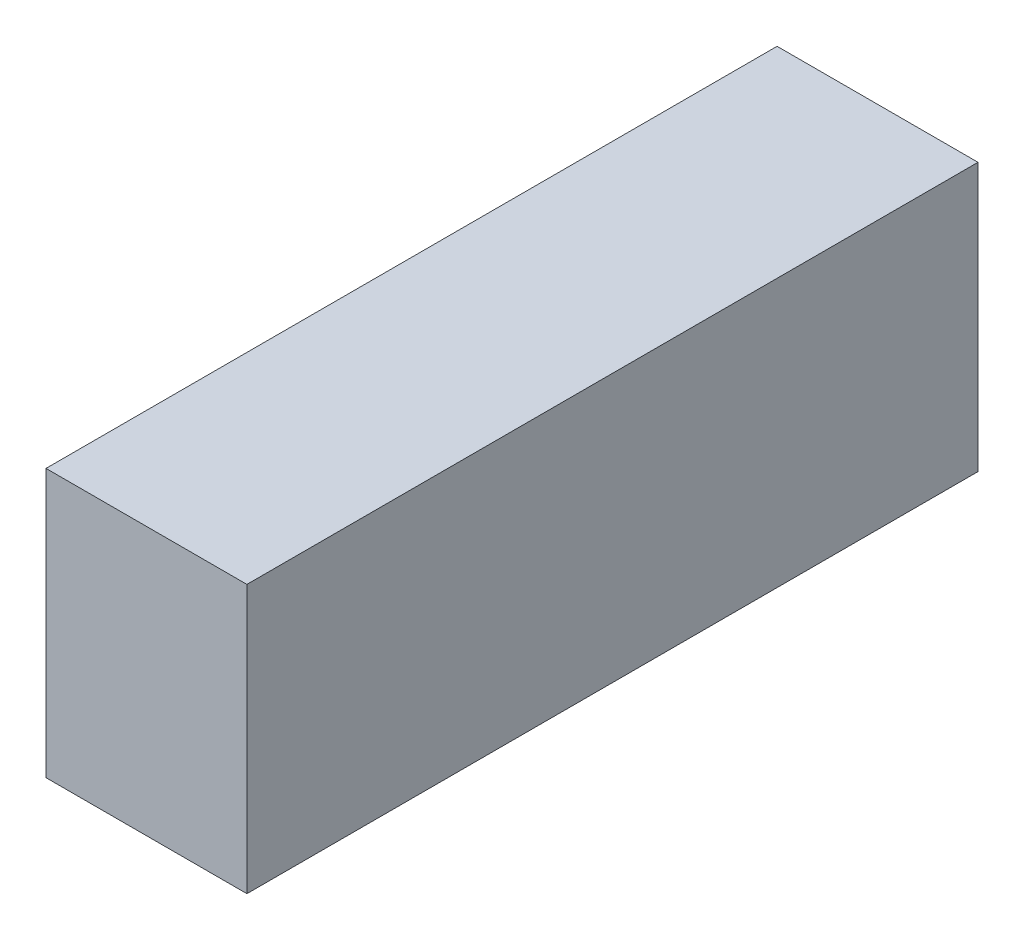
ISO-10303-21;
HEADER;
FILE_DESCRIPTION(('STEP AP214'),'2;1');
FILE_NAME('part.step','',(''),(''),'','','');
FILE_SCHEMA(('AUTOMOTIVE_DESIGN { 1 0 10303 214 1 1 1 1 }'));
ENDSEC;
DATA;
#1=APPLICATION_CONTEXT('core data for automotive mechanical design processes');
#2=APPLICATION_PROTOCOL_DEFINITION('international standard','automotive_design',2000,#1);
#3=PRODUCT_CONTEXT('',#1,'mechanical');
#4=PRODUCT('Part','Part','',(#3));
#5=PRODUCT_RELATED_PRODUCT_CATEGORY('part','',(#4));
#6=PRODUCT_DEFINITION_FORMATION('','',#4);
#7=PRODUCT_DEFINITION_CONTEXT('part definition',#1,'design');
#8=PRODUCT_DEFINITION('design','',#6,#7);
#9=PRODUCT_DEFINITION_SHAPE('','',#8);
#10=(LENGTH_UNIT() NAMED_UNIT(*) SI_UNIT(.MILLI.,.METRE.));
#11=(NAMED_UNIT(*) PLANE_ANGLE_UNIT() SI_UNIT($,.RADIAN.));
#12=(NAMED_UNIT(*) SI_UNIT($,.STERADIAN.) SOLID_ANGLE_UNIT());
#13=UNCERTAINTY_MEASURE_WITH_UNIT(LENGTH_MEASURE(1.E-05),#10,'distance_accuracy_value','');
#14=(GEOMETRIC_REPRESENTATION_CONTEXT(3) GLOBAL_UNCERTAINTY_ASSIGNED_CONTEXT((#13)) GLOBAL_UNIT_ASSIGNED_CONTEXT((#10,
#11,#12)) REPRESENTATION_CONTEXT('',''));
#15=CARTESIAN_POINT('',(0.,0.,0.));
#16=DIRECTION('',(0.,0.,1.));
#17=DIRECTION('',(1.,0.,0.));
#18=AXIS2_PLACEMENT_3D('',#15,#16,#17);
#19=CARTESIAN_POINT('',(175.870101481626,113.055203443449,415.925));
#20=DIRECTION('',(-1.,0.,0.));
#21=DIRECTION('',(0.,-1.,0.));
#22=AXIS2_PLACEMENT_3D('',#19,#20,#21);
#23=PLANE('',#22);
#24=DIRECTION('',(0.,1.,0.));
#25=VECTOR('',#24,1.);
#26=CARTESIAN_POINT('',(175.870101481626,113.055203443449,0.));
#27=LINE('',#26,#25);
#28=CARTESIAN_POINT('',(175.870101481626,-39.3447965565512,0.));
#29=VERTEX_POINT('',#28);
#30=CARTESIAN_POINT('',(175.870101481626,113.055203443449,0.));
#31=VERTEX_POINT('',#30);
#32=EDGE_CURVE('E111',#29,#31,#27,.T.);
#33=ORIENTED_EDGE('',*,*,#32,.T.);
#34=DIRECTION('',(0.,0.,-1.));
#35=VECTOR('',#34,1.);
#36=CARTESIAN_POINT('',(175.870101481626,113.055203443449,415.925));
#37=LINE('',#36,#35);
#38=CARTESIAN_POINT('',(175.870101481626,113.055203443449,415.925));
#39=VERTEX_POINT('',#38);
#40=EDGE_CURVE('E11',#39,#31,#37,.T.);
#41=ORIENTED_EDGE('',*,*,#40,.F.);
#42=DIRECTION('',(0.,1.,0.));
#43=VECTOR('',#42,1.);
#44=CARTESIAN_POINT('',(175.870101481626,113.055203443449,415.925));
#45=LINE('',#44,#43);
#46=CARTESIAN_POINT('',(175.870101481626,-39.3447965565512,415.925));
#47=VERTEX_POINT('',#46);
#48=EDGE_CURVE('E99',#47,#39,#45,.T.);
#49=ORIENTED_EDGE('',*,*,#48,.F.);
#50=DIRECTION('',(0.,0.,-1.));
#51=VECTOR('',#50,1.);
#52=CARTESIAN_POINT('',(175.870101481626,-39.3447965565512,415.925));
#53=LINE('',#52,#51);
#54=EDGE_CURVE('E107',#47,#29,#53,.T.);
#55=ORIENTED_EDGE('',*,*,#54,.T.);
#56=EDGE_LOOP('',(#33,#41,#49,#55));
#57=FACE_BOUND('',#56,.T.);
#58=ADVANCED_FACE('F48',(#57),#23,.F.);
#59=CARTESIAN_POINT('',(175.870101481626,113.055203443449,415.925));
#60=DIRECTION('',(0.,-1.,0.));
#61=DIRECTION('',(1.,0.,0.));
#62=AXIS2_PLACEMENT_3D('',#59,#60,#61);
#63=PLANE('',#62);
#64=DIRECTION('',(-1.,0.,0.));
#65=VECTOR('',#64,1.);
#66=CARTESIAN_POINT('',(175.870101481626,113.055203443449,0.));
#67=LINE('',#66,#65);
#68=CARTESIAN_POINT('',(61.5701014816259,113.055203443449,0.));
#69=VERTEX_POINT('',#68);
#70=EDGE_CURVE('E103',#31,#69,#67,.T.);
#71=ORIENTED_EDGE('',*,*,#70,.T.);
#72=DIRECTION('',(0.,0.,-1.));
#73=VECTOR('',#72,1.);
#74=CARTESIAN_POINT('',(61.5701014816259,113.055203443449,415.925));
#75=LINE('',#74,#73);
#76=CARTESIAN_POINT('',(61.5701014816259,113.055203443449,415.925));
#77=VERTEX_POINT('',#76);
#78=EDGE_CURVE('E56',#77,#69,#75,.T.);
#79=ORIENTED_EDGE('',*,*,#78,.F.);
#80=DIRECTION('',(-1.,0.,0.));
#81=VECTOR('',#80,1.);
#82=CARTESIAN_POINT('',(175.870101481626,113.055203443449,415.925));
#83=LINE('',#82,#81);
#84=EDGE_CURVE('E94',#39,#77,#83,.T.);
#85=ORIENTED_EDGE('',*,*,#84,.F.);
#86=ORIENTED_EDGE('',*,*,#40,.T.);
#87=EDGE_LOOP('',(#71,#79,#85,#86));
#88=FACE_BOUND('',#87,.T.);
#89=ADVANCED_FACE('F102',(#88),#63,.F.);
#90=CARTESIAN_POINT('',(61.5701014816259,113.055203443449,415.925));
#91=DIRECTION('',(1.,0.,0.));
#92=DIRECTION('',(0.,0.,-1.));
#93=AXIS2_PLACEMENT_3D('',#90,#91,#92);
#94=PLANE('',#93);
#95=DIRECTION('',(0.,-1.,0.));
#96=VECTOR('',#95,1.);
#97=CARTESIAN_POINT('',(61.5701014816259,113.055203443449,0.));
#98=LINE('',#97,#96);
#99=CARTESIAN_POINT('',(61.5701014816259,-39.3447965565512,0.));
#100=VERTEX_POINT('',#99);
#101=EDGE_CURVE('E81',#69,#100,#98,.T.);
#102=ORIENTED_EDGE('',*,*,#101,.T.);
#103=DIRECTION('',(0.,0.,-1.));
#104=VECTOR('',#103,1.);
#105=CARTESIAN_POINT('',(61.5701014816259,-39.3447965565512,415.925));
#106=LINE('',#105,#104);
#107=CARTESIAN_POINT('',(61.5701014816259,-39.3447965565512,415.925));
#108=VERTEX_POINT('',#107);
#109=EDGE_CURVE('E104',#108,#100,#106,.T.);
#110=ORIENTED_EDGE('',*,*,#109,.F.);
#111=DIRECTION('',(0.,-1.,0.));
#112=VECTOR('',#111,1.);
#113=CARTESIAN_POINT('',(61.5701014816259,113.055203443449,415.925));
#114=LINE('',#113,#112);
#115=EDGE_CURVE('E97',#77,#108,#114,.T.);
#116=ORIENTED_EDGE('',*,*,#115,.F.);
#117=ORIENTED_EDGE('',*,*,#78,.T.);
#118=EDGE_LOOP('',(#102,#110,#116,#117));
#119=FACE_BOUND('',#118,.T.);
#120=ADVANCED_FACE('F105',(#119),#94,.F.);
#121=CARTESIAN_POINT('',(175.870101481626,-39.3447965565512,415.925));
#122=DIRECTION('',(0.,1.,0.));
#123=DIRECTION('',(-1.,0.,0.));
#124=AXIS2_PLACEMENT_3D('',#121,#122,#123);
#125=PLANE('',#124);
#126=DIRECTION('',(1.,0.,0.));
#127=VECTOR('',#126,1.);
#128=CARTESIAN_POINT('',(175.870101481626,-39.3447965565512,0.));
#129=LINE('',#128,#127);
#130=EDGE_CURVE('E87',#100,#29,#129,.T.);
#131=ORIENTED_EDGE('',*,*,#130,.T.);
#132=ORIENTED_EDGE('',*,*,#54,.F.);
#133=DIRECTION('',(1.,0.,0.));
#134=VECTOR('',#133,1.);
#135=CARTESIAN_POINT('',(175.870101481626,-39.3447965565512,415.925));
#136=LINE('',#135,#134);
#137=EDGE_CURVE('E64',#108,#47,#136,.T.);
#138=ORIENTED_EDGE('',*,*,#137,.F.);
#139=ORIENTED_EDGE('',*,*,#109,.T.);
#140=EDGE_LOOP('',(#131,#132,#138,#139));
#141=FACE_BOUND('',#140,.T.);
#142=ADVANCED_FACE('F118',(#141),#125,.F.);
#143=CARTESIAN_POINT('',(0.,0.,415.925));
#144=DIRECTION('',(0.,0.,-1.));
#145=DIRECTION('',(-1.,0.,0.));
#146=AXIS2_PLACEMENT_3D('',#143,#144,#145);
#147=PLANE('',#146);
#148=ORIENTED_EDGE('',*,*,#48,.T.);
#149=ORIENTED_EDGE('',*,*,#84,.T.);
#150=ORIENTED_EDGE('',*,*,#115,.T.);
#151=ORIENTED_EDGE('',*,*,#137,.T.);
#152=EDGE_LOOP('',(#148,#149,#150,#151));
#153=FACE_BOUND('',#152,.T.);
#154=ADVANCED_FACE('F95',(#153),#147,.F.);
#155=CARTESIAN_POINT('',(0.,0.,0.));
#156=DIRECTION('',(0.,0.,-1.));
#157=DIRECTION('',(-1.,0.,0.));
#158=AXIS2_PLACEMENT_3D('',#155,#156,#157);
#159=PLANE('',#158);
#160=ORIENTED_EDGE('',*,*,#32,.F.);
#161=ORIENTED_EDGE('',*,*,#130,.F.);
#162=ORIENTED_EDGE('',*,*,#101,.F.);
#163=ORIENTED_EDGE('',*,*,#70,.F.);
#164=EDGE_LOOP('',(#160,#161,#162,#163));
#165=FACE_BOUND('',#164,.T.);
#166=ADVANCED_FACE('F121',(#165),#159,.T.);
#167=CLOSED_SHELL('',(#58,#89,#120,#142,#154,#166));
#168=MANIFOLD_SOLID_BREP('B2',#167);
#169=ADVANCED_BREP_SHAPE_REPRESENTATION('',(#18,#168),#14);
#170=SHAPE_DEFINITION_REPRESENTATION(#9,#169);
ENDSEC;
END-ISO-10303-21;
